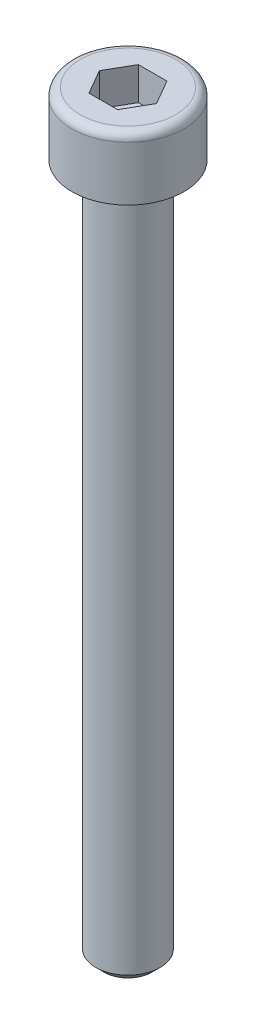
ISO-10303-21;
HEADER;
FILE_DESCRIPTION(('STEP AP214'),'2;1');
FILE_NAME('part.step','',(''),(''),'','','');
FILE_SCHEMA(('AUTOMOTIVE_DESIGN { 1 0 10303 214 1 1 1 1 }'));
ENDSEC;
DATA;
#1=APPLICATION_CONTEXT('core data for automotive mechanical design processes');
#2=APPLICATION_PROTOCOL_DEFINITION('international standard','automotive_design',2000,#1);
#3=PRODUCT_CONTEXT('',#1,'mechanical');
#4=PRODUCT('Part','Part','',(#3));
#5=PRODUCT_RELATED_PRODUCT_CATEGORY('part','',(#4));
#6=PRODUCT_DEFINITION_FORMATION('','',#4);
#7=PRODUCT_DEFINITION_CONTEXT('part definition',#1,'design');
#8=PRODUCT_DEFINITION('design','',#6,#7);
#9=PRODUCT_DEFINITION_SHAPE('','',#8);
#10=(LENGTH_UNIT() NAMED_UNIT(*) SI_UNIT(.MILLI.,.METRE.));
#11=(NAMED_UNIT(*) PLANE_ANGLE_UNIT() SI_UNIT($,.RADIAN.));
#12=(NAMED_UNIT(*) SI_UNIT($,.STERADIAN.) SOLID_ANGLE_UNIT());
#13=UNCERTAINTY_MEASURE_WITH_UNIT(LENGTH_MEASURE(1.E-05),#10,'distance_accuracy_value','');
#14=(GEOMETRIC_REPRESENTATION_CONTEXT(3) GLOBAL_UNCERTAINTY_ASSIGNED_CONTEXT((#13)) GLOBAL_UNIT_ASSIGNED_CONTEXT((#10,
#11,#12)) REPRESENTATION_CONTEXT('',''));
#15=CARTESIAN_POINT('',(0.,0.,0.));
#16=DIRECTION('',(0.,0.,1.));
#17=DIRECTION('',(1.,0.,0.));
#18=AXIS2_PLACEMENT_3D('',#15,#16,#17);
#19=CARTESIAN_POINT('',(0.,3.8,0.));
#20=DIRECTION('',(0.,1.,0.));
#21=DIRECTION('',(-1.,0.,0.));
#22=AXIS2_PLACEMENT_3D('',#19,#20,#21);
#23=PLANE('',#22);
#24=DIRECTION('',(0.5,0.,-0.866025403784439));
#25=VECTOR('',#24,1.);
#26=CARTESIAN_POINT('',(0.866025403784438,3.8,1.5));
#27=LINE('',#26,#25);
#28=CARTESIAN_POINT('',(0.866025403784438,3.8,1.5));
#29=VERTEX_POINT('',#28);
#30=CARTESIAN_POINT('',(1.73205080756888,3.8,0.));
#31=VERTEX_POINT('',#30);
#32=EDGE_CURVE('E44',#29,#31,#27,.T.);
#33=ORIENTED_EDGE('',*,*,#32,.F.);
#34=DIRECTION('',(1.,0.,0.));
#35=VECTOR('',#34,1.);
#36=CARTESIAN_POINT('',(-0.86602540378444,3.8,1.5));
#37=LINE('',#36,#35);
#38=CARTESIAN_POINT('',(-0.86602540378444,3.8,1.5));
#39=VERTEX_POINT('',#38);
#40=EDGE_CURVE('E127',#39,#29,#37,.T.);
#41=ORIENTED_EDGE('',*,*,#40,.F.);
#42=DIRECTION('',(0.5,0.,0.866025403784439));
#43=VECTOR('',#42,1.);
#44=CARTESIAN_POINT('',(-1.73205080756888,3.8,0.));
#45=LINE('',#44,#43);
#46=CARTESIAN_POINT('',(-1.73205080756888,3.8,0.));
#47=VERTEX_POINT('',#46);
#48=EDGE_CURVE('E125',#47,#39,#45,.T.);
#49=ORIENTED_EDGE('',*,*,#48,.F.);
#50=DIRECTION('',(-0.5,0.,0.866025403784439));
#51=VECTOR('',#50,1.);
#52=CARTESIAN_POINT('',(-0.866025403784439,3.8,-1.5));
#53=LINE('',#52,#51);
#54=CARTESIAN_POINT('',(-0.866025403784439,3.8,-1.5));
#55=VERTEX_POINT('',#54);
#56=EDGE_CURVE('E92',#55,#47,#53,.T.);
#57=ORIENTED_EDGE('',*,*,#56,.F.);
#58=DIRECTION('',(-1.,0.,0.));
#59=VECTOR('',#58,1.);
#60=CARTESIAN_POINT('',(0.866025403784439,3.8,-1.5));
#61=LINE('',#60,#59);
#62=CARTESIAN_POINT('',(0.866025403784439,3.8,-1.5));
#63=VERTEX_POINT('',#62);
#64=EDGE_CURVE('E121',#63,#55,#61,.T.);
#65=ORIENTED_EDGE('',*,*,#64,.F.);
#66=DIRECTION('',(-0.5,0.,-0.866025403784439));
#67=VECTOR('',#66,1.);
#68=CARTESIAN_POINT('',(1.73205080756888,3.8,0.));
#69=LINE('',#68,#67);
#70=EDGE_CURVE('E118',#31,#63,#69,.T.);
#71=ORIENTED_EDGE('',*,*,#70,.F.);
#72=EDGE_LOOP('',(#33,#41,#49,#57,#65,#71));
#73=FACE_BOUND('',#72,.T.);
#74=CARTESIAN_POINT('',(0.,3.8,0.));
#75=DIRECTION('',(0.,1.,0.));
#76=DIRECTION('',(-1.,0.,0.));
#77=AXIS2_PLACEMENT_3D('',#74,#75,#76);
#78=CIRCLE('',#77,2.9);
#79=CARTESIAN_POINT('',(-2.9,3.8,0.));
#80=VERTEX_POINT('',#79);
#81=EDGE_CURVE('E11',#80,#80,#78,.T.);
#82=ORIENTED_EDGE('',*,*,#81,.T.);
#83=EDGE_LOOP('',(#82));
#84=FACE_BOUND('',#83,.T.);
#85=ADVANCED_FACE('F30',(#73,#84),#23,.T.);
#86=CARTESIAN_POINT('',(0.,3.3,0.));
#87=DIRECTION('',(0.,1.,0.));
#88=DIRECTION('',(-1.,0.,0.));
#89=AXIS2_PLACEMENT_3D('',#86,#87,#88);
#90=TOROIDAL_SURFACE('',#89,2.9,0.5);
#91=CARTESIAN_POINT('',(0.,3.3,0.));
#92=DIRECTION('',(0.,1.,0.));
#93=DIRECTION('',(-1.,0.,0.));
#94=AXIS2_PLACEMENT_3D('',#91,#92,#93);
#95=CIRCLE('',#94,3.4);
#96=CARTESIAN_POINT('',(-3.4,3.3,0.));
#97=VERTEX_POINT('',#96);
#98=EDGE_CURVE('E37',#97,#97,#95,.T.);
#99=ORIENTED_EDGE('',*,*,#98,.T.);
#100=EDGE_LOOP('',(#99));
#101=FACE_BOUND('',#100,.T.);
#102=ORIENTED_EDGE('',*,*,#81,.F.);
#103=EDGE_LOOP('',(#102));
#104=FACE_BOUND('',#103,.T.);
#105=ADVANCED_FACE('F150',(#101,#104),#90,.T.);
#106=CARTESIAN_POINT('',(0.,3.8,0.));
#107=DIRECTION('',(0.,1.,0.));
#108=DIRECTION('',(-1.,0.,0.));
#109=AXIS2_PLACEMENT_3D('',#106,#107,#108);
#110=CYLINDRICAL_SURFACE('',#109,3.4);
#111=CARTESIAN_POINT('',(0.,0.,0.));
#112=DIRECTION('',(0.,1.,0.));
#113=DIRECTION('',(-1.,0.,0.));
#114=AXIS2_PLACEMENT_3D('',#111,#112,#113);
#115=CIRCLE('',#114,3.4);
#116=CARTESIAN_POINT('',(-3.4,0.,0.));
#117=VERTEX_POINT('',#116);
#118=EDGE_CURVE('E145',#117,#117,#115,.T.);
#119=ORIENTED_EDGE('',*,*,#118,.T.);
#120=EDGE_LOOP('',(#119));
#121=FACE_BOUND('',#120,.T.);
#122=ORIENTED_EDGE('',*,*,#98,.F.);
#123=EDGE_LOOP('',(#122));
#124=FACE_BOUND('',#123,.T.);
#125=ADVANCED_FACE('F153',(#121,#124),#110,.T.);
#126=CARTESIAN_POINT('',(-3.4,0.,0.));
#127=DIRECTION('',(0.,-1.,0.));
#128=DIRECTION('',(1.,0.,0.));
#129=AXIS2_PLACEMENT_3D('',#126,#127,#128);
#130=PLANE('',#129);
#131=CARTESIAN_POINT('',(0.,0.,0.));
#132=DIRECTION('',(0.,1.,0.));
#133=DIRECTION('',(-1.,0.,0.));
#134=AXIS2_PLACEMENT_3D('',#131,#132,#133);
#135=CIRCLE('',#134,1.95);
#136=CARTESIAN_POINT('',(-1.95,0.,0.));
#137=VERTEX_POINT('',#136);
#138=EDGE_CURVE('E142',#137,#137,#135,.T.);
#139=ORIENTED_EDGE('',*,*,#138,.T.);
#140=EDGE_LOOP('',(#139));
#141=FACE_BOUND('',#140,.T.);
#142=ORIENTED_EDGE('',*,*,#118,.F.);
#143=EDGE_LOOP('',(#142));
#144=FACE_BOUND('',#143,.T.);
#145=ADVANCED_FACE('F155',(#141,#144),#130,.T.);
#146=CARTESIAN_POINT('',(0.,3.8,0.));
#147=DIRECTION('',(0.,1.,0.));
#148=DIRECTION('',(-1.,0.,0.));
#149=AXIS2_PLACEMENT_3D('',#146,#147,#148);
#150=CYLINDRICAL_SURFACE('',#149,1.95);
#151=CARTESIAN_POINT('',(0.,-41.5,0.));
#152=DIRECTION('',(0.,1.,0.));
#153=DIRECTION('',(-1.,0.,0.));
#154=AXIS2_PLACEMENT_3D('',#151,#152,#153);
#155=CIRCLE('',#154,1.95);
#156=CARTESIAN_POINT('',(-1.94999999999999,-41.5,0.));
#157=VERTEX_POINT('',#156);
#158=EDGE_CURVE('E139',#157,#157,#155,.T.);
#159=ORIENTED_EDGE('',*,*,#158,.T.);
#160=EDGE_LOOP('',(#159));
#161=FACE_BOUND('',#160,.T.);
#162=ORIENTED_EDGE('',*,*,#138,.F.);
#163=EDGE_LOOP('',(#162));
#164=FACE_BOUND('',#163,.T.);
#165=ADVANCED_FACE('F162',(#161,#164),#150,.T.);
#166=CARTESIAN_POINT('',(0.,-41.5,0.));
#167=DIRECTION('',(0.,1.,0.));
#168=DIRECTION('',(-1.,0.,0.));
#169=AXIS2_PLACEMENT_3D('',#166,#167,#168);
#170=CONICAL_SURFACE('',#169,1.95,0.785398163397448);
#171=CARTESIAN_POINT('',(0.,-42.,0.));
#172=DIRECTION('',(0.,1.,0.));
#173=DIRECTION('',(-1.,0.,0.));
#174=AXIS2_PLACEMENT_3D('',#171,#172,#173);
#175=CIRCLE('',#174,1.45);
#176=CARTESIAN_POINT('',(-1.44999999999999,-42.,0.));
#177=VERTEX_POINT('',#176);
#178=EDGE_CURVE('E131',#177,#177,#175,.T.);
#179=ORIENTED_EDGE('',*,*,#178,.T.);
#180=EDGE_LOOP('',(#179));
#181=FACE_BOUND('',#180,.T.);
#182=ORIENTED_EDGE('',*,*,#158,.F.);
#183=EDGE_LOOP('',(#182));
#184=FACE_BOUND('',#183,.T.);
#185=ADVANCED_FACE('F187',(#181,#184),#170,.T.);
#186=CARTESIAN_POINT('',(-1.44999999999999,-42.,0.));
#187=DIRECTION('',(0.,-1.,0.));
#188=DIRECTION('',(1.,0.,0.));
#189=AXIS2_PLACEMENT_3D('',#186,#187,#188);
#190=PLANE('',#189);
#191=ORIENTED_EDGE('',*,*,#178,.F.);
#192=EDGE_LOOP('',(#191));
#193=FACE_BOUND('',#192,.T.);
#194=ADVANCED_FACE('F180',(#193),#190,.T.);
#195=CARTESIAN_POINT('',(0.866025403784438,1.8,1.5));
#196=DIRECTION('',(0.866025403784439,0.,0.5));
#197=DIRECTION('',(0.5,0.,-0.866025403784439));
#198=AXIS2_PLACEMENT_3D('',#195,#196,#197);
#199=PLANE('',#198);
#200=ORIENTED_EDGE('',*,*,#32,.T.);
#201=DIRECTION('',(0.,1.,0.));
#202=VECTOR('',#201,1.);
#203=CARTESIAN_POINT('',(1.73205080756888,1.8,0.));
#204=LINE('',#203,#202);
#205=CARTESIAN_POINT('',(1.73205080756888,1.8,0.));
#206=VERTEX_POINT('',#205);
#207=EDGE_CURVE('E74',#206,#31,#204,.T.);
#208=ORIENTED_EDGE('',*,*,#207,.F.);
#209=DIRECTION('',(0.5,0.,-0.866025403784439));
#210=VECTOR('',#209,1.);
#211=CARTESIAN_POINT('',(0.866025403784438,1.8,1.5));
#212=LINE('',#211,#210);
#213=CARTESIAN_POINT('',(0.866025403784438,1.8,1.5));
#214=VERTEX_POINT('',#213);
#215=EDGE_CURVE('E129',#214,#206,#212,.T.);
#216=ORIENTED_EDGE('',*,*,#215,.F.);
#217=DIRECTION('',(0.,1.,0.));
#218=VECTOR('',#217,1.);
#219=CARTESIAN_POINT('',(0.866025403784438,1.8,1.5));
#220=LINE('',#219,#218);
#221=EDGE_CURVE('E52',#214,#29,#220,.T.);
#222=ORIENTED_EDGE('',*,*,#221,.T.);
#223=EDGE_LOOP('',(#200,#208,#216,#222));
#224=FACE_BOUND('',#223,.T.);
#225=ADVANCED_FACE('F177',(#224),#199,.F.);
#226=CARTESIAN_POINT('',(-0.86602540378444,1.8,1.5));
#227=DIRECTION('',(0.,0.,1.));
#228=DIRECTION('',(1.,0.,0.));
#229=AXIS2_PLACEMENT_3D('',#226,#227,#228);
#230=PLANE('',#229);
#231=ORIENTED_EDGE('',*,*,#40,.T.);
#232=ORIENTED_EDGE('',*,*,#221,.F.);
#233=DIRECTION('',(1.,0.,0.));
#234=VECTOR('',#233,1.);
#235=CARTESIAN_POINT('',(-0.86602540378444,1.8,1.5));
#236=LINE('',#235,#234);
#237=CARTESIAN_POINT('',(-0.86602540378444,1.8,1.5));
#238=VERTEX_POINT('',#237);
#239=EDGE_CURVE('E104',#238,#214,#236,.T.);
#240=ORIENTED_EDGE('',*,*,#239,.F.);
#241=DIRECTION('',(0.,1.,0.));
#242=VECTOR('',#241,1.);
#243=CARTESIAN_POINT('',(-0.86602540378444,1.8,1.5));
#244=LINE('',#243,#242);
#245=EDGE_CURVE('E96',#238,#39,#244,.T.);
#246=ORIENTED_EDGE('',*,*,#245,.T.);
#247=EDGE_LOOP('',(#231,#232,#240,#246));
#248=FACE_BOUND('',#247,.T.);
#249=ADVANCED_FACE('F179',(#248),#230,.F.);
#250=CARTESIAN_POINT('',(-1.73205080756888,1.8,0.));
#251=DIRECTION('',(-0.866025403784439,0.,0.5));
#252=DIRECTION('',(0.5,0.,0.866025403784439));
#253=AXIS2_PLACEMENT_3D('',#250,#251,#252);
#254=PLANE('',#253);
#255=ORIENTED_EDGE('',*,*,#48,.T.);
#256=ORIENTED_EDGE('',*,*,#245,.F.);
#257=DIRECTION('',(0.5,0.,0.866025403784439));
#258=VECTOR('',#257,1.);
#259=CARTESIAN_POINT('',(-1.73205080756888,1.8,0.));
#260=LINE('',#259,#258);
#261=CARTESIAN_POINT('',(-1.73205080756888,1.8,0.));
#262=VERTEX_POINT('',#261);
#263=EDGE_CURVE('E100',#262,#238,#260,.T.);
#264=ORIENTED_EDGE('',*,*,#263,.F.);
#265=DIRECTION('',(0.,1.,0.));
#266=VECTOR('',#265,1.);
#267=CARTESIAN_POINT('',(-1.73205080756888,1.8,0.));
#268=LINE('',#267,#266);
#269=EDGE_CURVE('E85',#262,#47,#268,.T.);
#270=ORIENTED_EDGE('',*,*,#269,.T.);
#271=EDGE_LOOP('',(#255,#256,#264,#270));
#272=FACE_BOUND('',#271,.T.);
#273=ADVANCED_FACE('F101',(#272),#254,.F.);
#274=CARTESIAN_POINT('',(-0.866025403784438,1.8,-1.5));
#275=DIRECTION('',(-0.866025403784439,0.,-0.5));
#276=DIRECTION('',(-0.5,0.,0.866025403784439));
#277=AXIS2_PLACEMENT_3D('',#274,#275,#276);
#278=PLANE('',#277);
#279=ORIENTED_EDGE('',*,*,#56,.T.);
#280=ORIENTED_EDGE('',*,*,#269,.F.);
#281=DIRECTION('',(-0.5,0.,0.866025403784439));
#282=VECTOR('',#281,1.);
#283=CARTESIAN_POINT('',(-0.866025403784438,1.8,-1.5));
#284=LINE('',#283,#282);
#285=CARTESIAN_POINT('',(-0.866025403784438,1.8,-1.5));
#286=VERTEX_POINT('',#285);
#287=EDGE_CURVE('E89',#286,#262,#284,.T.);
#288=ORIENTED_EDGE('',*,*,#287,.F.);
#289=DIRECTION('',(0.,1.,0.));
#290=VECTOR('',#289,1.);
#291=CARTESIAN_POINT('',(-0.866025403784438,1.8,-1.5));
#292=LINE('',#291,#290);
#293=EDGE_CURVE('E97',#286,#55,#292,.T.);
#294=ORIENTED_EDGE('',*,*,#293,.T.);
#295=EDGE_LOOP('',(#279,#280,#288,#294));
#296=FACE_BOUND('',#295,.T.);
#297=ADVANCED_FACE('F87',(#296),#278,.F.);
#298=CARTESIAN_POINT('',(0.866025403784439,1.8,-1.5));
#299=DIRECTION('',(0.,0.,-1.));
#300=DIRECTION('',(-1.,0.,0.));
#301=AXIS2_PLACEMENT_3D('',#298,#299,#300);
#302=PLANE('',#301);
#303=ORIENTED_EDGE('',*,*,#64,.T.);
#304=ORIENTED_EDGE('',*,*,#293,.F.);
#305=DIRECTION('',(-1.,0.,0.));
#306=VECTOR('',#305,1.);
#307=CARTESIAN_POINT('',(0.866025403784439,1.8,-1.5));
#308=LINE('',#307,#306);
#309=CARTESIAN_POINT('',(0.866025403784439,1.8,-1.5));
#310=VERTEX_POINT('',#309);
#311=EDGE_CURVE('E110',#310,#286,#308,.T.);
#312=ORIENTED_EDGE('',*,*,#311,.F.);
#313=DIRECTION('',(0.,1.,0.));
#314=VECTOR('',#313,1.);
#315=CARTESIAN_POINT('',(0.866025403784439,1.8,-1.5));
#316=LINE('',#315,#314);
#317=EDGE_CURVE('E134',#310,#63,#316,.T.);
#318=ORIENTED_EDGE('',*,*,#317,.T.);
#319=EDGE_LOOP('',(#303,#304,#312,#318));
#320=FACE_BOUND('',#319,.T.);
#321=ADVANCED_FACE('F248',(#320),#302,.F.);
#322=CARTESIAN_POINT('',(1.73205080756888,1.8,0.));
#323=DIRECTION('',(0.866025403784439,0.,-0.5));
#324=DIRECTION('',(-0.5,0.,-0.866025403784439));
#325=AXIS2_PLACEMENT_3D('',#322,#323,#324);
#326=PLANE('',#325);
#327=ORIENTED_EDGE('',*,*,#70,.T.);
#328=ORIENTED_EDGE('',*,*,#317,.F.);
#329=DIRECTION('',(-0.5,0.,-0.866025403784439));
#330=VECTOR('',#329,1.);
#331=CARTESIAN_POINT('',(1.73205080756888,1.8,0.));
#332=LINE('',#331,#330);
#333=EDGE_CURVE('E112',#206,#310,#332,.T.);
#334=ORIENTED_EDGE('',*,*,#333,.F.);
#335=ORIENTED_EDGE('',*,*,#207,.T.);
#336=EDGE_LOOP('',(#327,#328,#334,#335));
#337=FACE_BOUND('',#336,.T.);
#338=ADVANCED_FACE('F175',(#337),#326,.F.);
#339=CARTESIAN_POINT('',(2.59807621135332,1.8,-1.5));
#340=DIRECTION('',(0.,1.,0.));
#341=DIRECTION('',(0.,0.,1.));
#342=AXIS2_PLACEMENT_3D('',#339,#340,#341);
#343=PLANE('',#342);
#344=ORIENTED_EDGE('',*,*,#215,.T.);
#345=ORIENTED_EDGE('',*,*,#333,.T.);
#346=ORIENTED_EDGE('',*,*,#311,.T.);
#347=ORIENTED_EDGE('',*,*,#287,.T.);
#348=ORIENTED_EDGE('',*,*,#263,.T.);
#349=ORIENTED_EDGE('',*,*,#239,.T.);
#350=EDGE_LOOP('',(#344,#345,#346,#347,#348,#349));
#351=FACE_BOUND('',#350,.T.);
#352=ADVANCED_FACE('F107',(#351),#343,.T.);
#353=CLOSED_SHELL('',(#85,#105,#125,#145,#165,#185,#194,#225,#249,#273,#297,#321,#338,#352));
#354=MANIFOLD_SOLID_BREP('B2',#353);
#355=ADVANCED_BREP_SHAPE_REPRESENTATION('',(#18,#354),#14);
#356=SHAPE_DEFINITION_REPRESENTATION(#9,#355);
ENDSEC;
END-ISO-10303-21;
